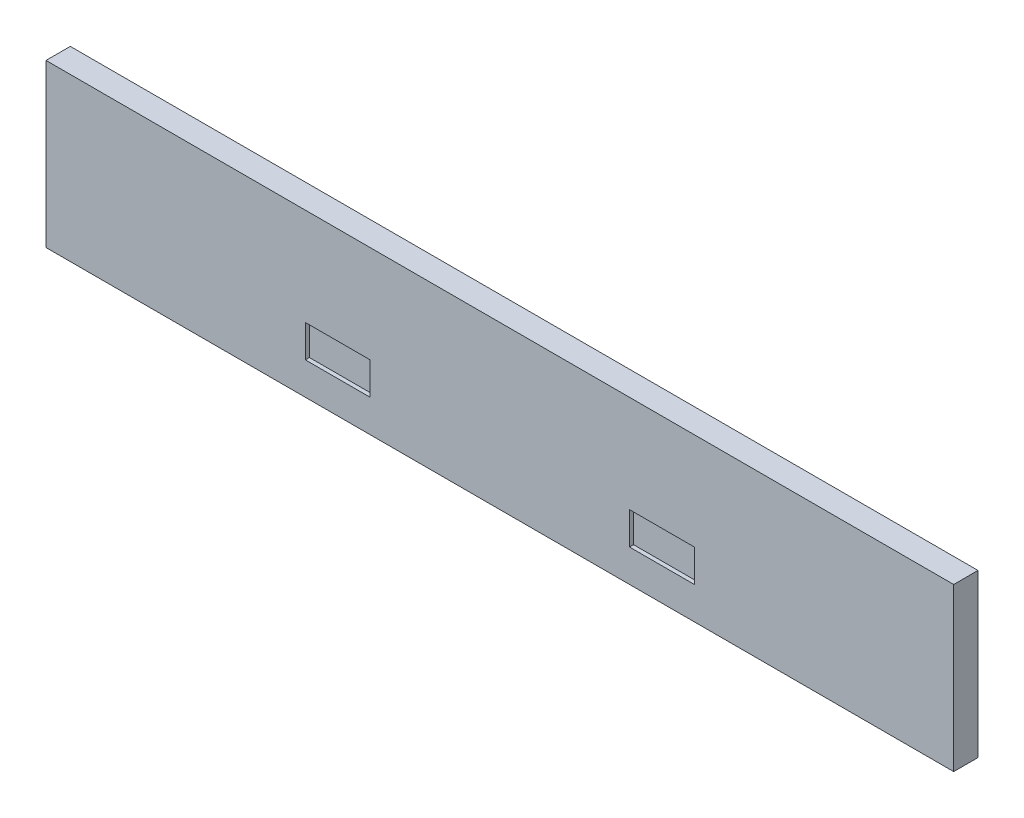
ISO-10303-21;
HEADER;
FILE_DESCRIPTION(('STEP AP214'),'2;1');
FILE_NAME('part.step','',(''),(''),'','','');
FILE_SCHEMA(('AUTOMOTIVE_DESIGN { 1 0 10303 214 1 1 1 1 }'));
ENDSEC;
DATA;
#1=APPLICATION_CONTEXT('core data for automotive mechanical design processes');
#2=APPLICATION_PROTOCOL_DEFINITION('international standard','automotive_design',2000,#1);
#3=PRODUCT_CONTEXT('',#1,'mechanical');
#4=PRODUCT('Part','Part','',(#3));
#5=PRODUCT_RELATED_PRODUCT_CATEGORY('part','',(#4));
#6=PRODUCT_DEFINITION_FORMATION('','',#4);
#7=PRODUCT_DEFINITION_CONTEXT('part definition',#1,'design');
#8=PRODUCT_DEFINITION('design','',#6,#7);
#9=PRODUCT_DEFINITION_SHAPE('','',#8);
#10=(LENGTH_UNIT() NAMED_UNIT(*) SI_UNIT(.MILLI.,.METRE.));
#11=(NAMED_UNIT(*) PLANE_ANGLE_UNIT() SI_UNIT($,.RADIAN.));
#12=(NAMED_UNIT(*) SI_UNIT($,.STERADIAN.) SOLID_ANGLE_UNIT());
#13=UNCERTAINTY_MEASURE_WITH_UNIT(LENGTH_MEASURE(1.E-05),#10,'distance_accuracy_value','');
#14=(GEOMETRIC_REPRESENTATION_CONTEXT(3) GLOBAL_UNCERTAINTY_ASSIGNED_CONTEXT((#13)) GLOBAL_UNIT_ASSIGNED_CONTEXT((#10,
#11,#12)) REPRESENTATION_CONTEXT('',''));
#15=CARTESIAN_POINT('',(0.,0.,0.));
#16=DIRECTION('',(0.,0.,1.));
#17=DIRECTION('',(1.,0.,0.));
#18=AXIS2_PLACEMENT_3D('',#15,#16,#17);
#19=CARTESIAN_POINT('',(0.,0.,19.05));
#20=DIRECTION('',(1.,0.,0.));
#21=DIRECTION('',(0.,0.,-1.));
#22=AXIS2_PLACEMENT_3D('',#19,#20,#21);
#23=PLANE('',#22);
#24=DIRECTION('',(0.,-1.,0.));
#25=VECTOR('',#24,1.);
#26=CARTESIAN_POINT('',(0.,0.,0.));
#27=LINE('',#26,#25);
#28=CARTESIAN_POINT('',(0.,127.,0.));
#29=VERTEX_POINT('',#28);
#30=CARTESIAN_POINT('',(0.,0.,0.));
#31=VERTEX_POINT('',#30);
#32=EDGE_CURVE('E158',#29,#31,#27,.T.);
#33=ORIENTED_EDGE('',*,*,#32,.T.);
#34=DIRECTION('',(0.,0.,-1.));
#35=VECTOR('',#34,1.);
#36=CARTESIAN_POINT('',(0.,0.,19.05));
#37=LINE('',#36,#35);
#38=CARTESIAN_POINT('',(0.,0.,19.05));
#39=VERTEX_POINT('',#38);
#40=EDGE_CURVE('E11',#39,#31,#37,.T.);
#41=ORIENTED_EDGE('',*,*,#40,.F.);
#42=DIRECTION('',(0.,-1.,0.));
#43=VECTOR('',#42,1.);
#44=CARTESIAN_POINT('',(0.,0.,19.05));
#45=LINE('',#44,#43);
#46=CARTESIAN_POINT('',(0.,127.,19.05));
#47=VERTEX_POINT('',#46);
#48=EDGE_CURVE('E191',#47,#39,#45,.T.);
#49=ORIENTED_EDGE('',*,*,#48,.F.);
#50=DIRECTION('',(0.,0.,-1.));
#51=VECTOR('',#50,1.);
#52=CARTESIAN_POINT('',(0.,127.,19.05));
#53=LINE('',#52,#51);
#54=EDGE_CURVE('E201',#47,#29,#53,.T.);
#55=ORIENTED_EDGE('',*,*,#54,.T.);
#56=EDGE_LOOP('',(#33,#41,#49,#55));
#57=FACE_BOUND('',#56,.T.);
#58=ADVANCED_FACE('F34',(#57),#23,.F.);
#59=CARTESIAN_POINT('',(0.,0.,19.05));
#60=DIRECTION('',(0.,1.,0.));
#61=DIRECTION('',(0.,0.,1.));
#62=AXIS2_PLACEMENT_3D('',#59,#60,#61);
#63=PLANE('',#62);
#64=DIRECTION('',(1.,0.,0.));
#65=VECTOR('',#64,1.);
#66=CARTESIAN_POINT('',(0.,0.,0.));
#67=LINE('',#66,#65);
#68=CARTESIAN_POINT('',(711.2,0.,0.));
#69=VERTEX_POINT('',#68);
#70=EDGE_CURVE('E204',#31,#69,#67,.T.);
#71=ORIENTED_EDGE('',*,*,#70,.T.);
#72=DIRECTION('',(0.,0.,-1.));
#73=VECTOR('',#72,1.);
#74=CARTESIAN_POINT('',(711.2,0.,19.05));
#75=LINE('',#74,#73);
#76=CARTESIAN_POINT('',(711.2,0.,19.05));
#77=VERTEX_POINT('',#76);
#78=EDGE_CURVE('E41',#77,#69,#75,.T.);
#79=ORIENTED_EDGE('',*,*,#78,.F.);
#80=DIRECTION('',(1.,0.,0.));
#81=VECTOR('',#80,1.);
#82=CARTESIAN_POINT('',(0.,0.,19.05));
#83=LINE('',#82,#81);
#84=EDGE_CURVE('E194',#39,#77,#83,.T.);
#85=ORIENTED_EDGE('',*,*,#84,.F.);
#86=ORIENTED_EDGE('',*,*,#40,.T.);
#87=EDGE_LOOP('',(#71,#79,#85,#86));
#88=FACE_BOUND('',#87,.T.);
#89=ADVANCED_FACE('F234',(#88),#63,.F.);
#90=CARTESIAN_POINT('',(711.2,0.,19.05));
#91=DIRECTION('',(-1.,0.,0.));
#92=DIRECTION('',(0.,0.,1.));
#93=AXIS2_PLACEMENT_3D('',#90,#91,#92);
#94=PLANE('',#93);
#95=DIRECTION('',(0.,1.,0.));
#96=VECTOR('',#95,1.);
#97=CARTESIAN_POINT('',(711.2,0.,0.));
#98=LINE('',#97,#96);
#99=CARTESIAN_POINT('',(711.2,127.,0.));
#100=VERTEX_POINT('',#99);
#101=EDGE_CURVE('E206',#69,#100,#98,.T.);
#102=ORIENTED_EDGE('',*,*,#101,.T.);
#103=DIRECTION('',(0.,0.,-1.));
#104=VECTOR('',#103,1.);
#105=CARTESIAN_POINT('',(711.2,127.,19.05));
#106=LINE('',#105,#104);
#107=CARTESIAN_POINT('',(711.2,127.,19.05));
#108=VERTEX_POINT('',#107);
#109=EDGE_CURVE('E211',#108,#100,#106,.T.);
#110=ORIENTED_EDGE('',*,*,#109,.F.);
#111=DIRECTION('',(0.,1.,0.));
#112=VECTOR('',#111,1.);
#113=CARTESIAN_POINT('',(711.2,0.,19.05));
#114=LINE('',#113,#112);
#115=EDGE_CURVE('E197',#77,#108,#114,.T.);
#116=ORIENTED_EDGE('',*,*,#115,.F.);
#117=ORIENTED_EDGE('',*,*,#78,.T.);
#118=EDGE_LOOP('',(#102,#110,#116,#117));
#119=FACE_BOUND('',#118,.T.);
#120=ADVANCED_FACE('F218',(#119),#94,.F.);
#121=CARTESIAN_POINT('',(0.,127.,19.05));
#122=DIRECTION('',(0.,-1.,0.));
#123=DIRECTION('',(0.,0.,-1.));
#124=AXIS2_PLACEMENT_3D('',#121,#122,#123);
#125=PLANE('',#124);
#126=DIRECTION('',(-1.,0.,0.));
#127=VECTOR('',#126,1.);
#128=CARTESIAN_POINT('',(0.,127.,0.));
#129=LINE('',#128,#127);
#130=EDGE_CURVE('E195',#100,#29,#129,.T.);
#131=ORIENTED_EDGE('',*,*,#130,.T.);
#132=ORIENTED_EDGE('',*,*,#54,.F.);
#133=DIRECTION('',(-1.,0.,0.));
#134=VECTOR('',#133,1.);
#135=CARTESIAN_POINT('',(0.,127.,19.05));
#136=LINE('',#135,#134);
#137=EDGE_CURVE('E199',#108,#47,#136,.T.);
#138=ORIENTED_EDGE('',*,*,#137,.F.);
#139=ORIENTED_EDGE('',*,*,#109,.T.);
#140=EDGE_LOOP('',(#131,#132,#138,#139));
#141=FACE_BOUND('',#140,.T.);
#142=ADVANCED_FACE('F227',(#141),#125,.F.);
#143=CARTESIAN_POINT('',(0.,0.,19.05));
#144=DIRECTION('',(0.,0.,-1.));
#145=DIRECTION('',(-1.,0.,0.));
#146=AXIS2_PLACEMENT_3D('',#143,#144,#145);
#147=PLANE('',#146);
#148=DIRECTION('',(1.,0.,0.));
#149=VECTOR('',#148,1.);
#150=CARTESIAN_POINT('',(203.2,25.4,19.05));
#151=LINE('',#150,#149);
#152=CARTESIAN_POINT('',(203.2,25.4,19.05));
#153=VERTEX_POINT('',#152);
#154=CARTESIAN_POINT('',(254.,25.4,19.05));
#155=VERTEX_POINT('',#154);
#156=EDGE_CURVE('E151',#153,#155,#151,.T.);
#157=ORIENTED_EDGE('',*,*,#156,.F.);
#158=DIRECTION('',(0.,-1.,0.));
#159=VECTOR('',#158,1.);
#160=CARTESIAN_POINT('',(203.2,50.8,19.05));
#161=LINE('',#160,#159);
#162=CARTESIAN_POINT('',(203.2,50.8,19.05));
#163=VERTEX_POINT('',#162);
#164=EDGE_CURVE('E48',#163,#153,#161,.T.);
#165=ORIENTED_EDGE('',*,*,#164,.F.);
#166=DIRECTION('',(-1.,0.,0.));
#167=VECTOR('',#166,1.);
#168=CARTESIAN_POINT('',(203.2,50.8,19.05));
#169=LINE('',#168,#167);
#170=CARTESIAN_POINT('',(254.,50.8,19.05));
#171=VERTEX_POINT('',#170);
#172=EDGE_CURVE('E142',#171,#163,#169,.T.);
#173=ORIENTED_EDGE('',*,*,#172,.F.);
#174=DIRECTION('',(0.,1.,0.));
#175=VECTOR('',#174,1.);
#176=CARTESIAN_POINT('',(254.,50.8,19.05));
#177=LINE('',#176,#175);
#178=EDGE_CURVE('E145',#155,#171,#177,.T.);
#179=ORIENTED_EDGE('',*,*,#178,.F.);
#180=EDGE_LOOP('',(#157,#165,#173,#179));
#181=FACE_BOUND('',#180,.T.);
#182=DIRECTION('',(1.,0.,0.));
#183=VECTOR('',#182,1.);
#184=CARTESIAN_POINT('',(457.2,25.4,19.05));
#185=LINE('',#184,#183);
#186=CARTESIAN_POINT('',(457.2,25.4,19.05));
#187=VERTEX_POINT('',#186);
#188=CARTESIAN_POINT('',(508.,25.4,19.05));
#189=VERTEX_POINT('',#188);
#190=EDGE_CURVE('E177',#187,#189,#185,.T.);
#191=ORIENTED_EDGE('',*,*,#190,.F.);
#192=DIRECTION('',(0.,-1.,0.));
#193=VECTOR('',#192,1.);
#194=CARTESIAN_POINT('',(457.2,50.8,19.05));
#195=LINE('',#194,#193);
#196=CARTESIAN_POINT('',(457.2,50.8,19.05));
#197=VERTEX_POINT('',#196);
#198=EDGE_CURVE('E56',#197,#187,#195,.T.);
#199=ORIENTED_EDGE('',*,*,#198,.F.);
#200=DIRECTION('',(-1.,0.,0.));
#201=VECTOR('',#200,1.);
#202=CARTESIAN_POINT('',(457.2,50.8,19.05));
#203=LINE('',#202,#201);
#204=CARTESIAN_POINT('',(508.,50.8,19.05));
#205=VERTEX_POINT('',#204);
#206=EDGE_CURVE('E166',#205,#197,#203,.T.);
#207=ORIENTED_EDGE('',*,*,#206,.F.);
#208=DIRECTION('',(0.,1.,0.));
#209=VECTOR('',#208,1.);
#210=CARTESIAN_POINT('',(508.,50.8,19.05));
#211=LINE('',#210,#209);
#212=EDGE_CURVE('E180',#189,#205,#211,.T.);
#213=ORIENTED_EDGE('',*,*,#212,.F.);
#214=EDGE_LOOP('',(#191,#199,#207,#213));
#215=FACE_BOUND('',#214,.T.);
#216=ORIENTED_EDGE('',*,*,#48,.T.);
#217=ORIENTED_EDGE('',*,*,#84,.T.);
#218=ORIENTED_EDGE('',*,*,#115,.T.);
#219=ORIENTED_EDGE('',*,*,#137,.T.);
#220=EDGE_LOOP('',(#216,#217,#218,#219));
#221=FACE_BOUND('',#220,.T.);
#222=ADVANCED_FACE('F233',(#181,#215,#221),#147,.F.);
#223=CARTESIAN_POINT('',(0.,0.,0.));
#224=DIRECTION('',(0.,0.,-1.));
#225=DIRECTION('',(-1.,0.,0.));
#226=AXIS2_PLACEMENT_3D('',#223,#224,#225);
#227=PLANE('',#226);
#228=ORIENTED_EDGE('',*,*,#32,.F.);
#229=ORIENTED_EDGE('',*,*,#130,.F.);
#230=ORIENTED_EDGE('',*,*,#101,.F.);
#231=ORIENTED_EDGE('',*,*,#70,.F.);
#232=EDGE_LOOP('',(#228,#229,#230,#231));
#233=FACE_BOUND('',#232,.T.);
#234=ADVANCED_FACE('F224',(#233),#227,.T.);
#235=CARTESIAN_POINT('',(457.2,50.8,15.875));
#236=DIRECTION('',(-1.,0.,0.));
#237=DIRECTION('',(0.,0.,1.));
#238=AXIS2_PLACEMENT_3D('',#235,#236,#237);
#239=PLANE('',#238);
#240=ORIENTED_EDGE('',*,*,#198,.T.);
#241=DIRECTION('',(0.,0.,1.));
#242=VECTOR('',#241,1.);
#243=CARTESIAN_POINT('',(457.2,25.4,15.875));
#244=LINE('',#243,#242);
#245=CARTESIAN_POINT('',(457.2,25.4,15.875));
#246=VERTEX_POINT('',#245);
#247=EDGE_CURVE('E175',#246,#187,#244,.T.);
#248=ORIENTED_EDGE('',*,*,#247,.F.);
#249=DIRECTION('',(0.,-1.,0.));
#250=VECTOR('',#249,1.);
#251=CARTESIAN_POINT('',(457.2,50.8,15.875));
#252=LINE('',#251,#250);
#253=CARTESIAN_POINT('',(457.2,50.8,15.875));
#254=VERTEX_POINT('',#253);
#255=EDGE_CURVE('E162',#254,#246,#252,.T.);
#256=ORIENTED_EDGE('',*,*,#255,.F.);
#257=DIRECTION('',(0.,0.,1.));
#258=VECTOR('',#257,1.);
#259=CARTESIAN_POINT('',(457.2,50.8,15.875));
#260=LINE('',#259,#258);
#261=EDGE_CURVE('E152',#254,#197,#260,.T.);
#262=ORIENTED_EDGE('',*,*,#261,.T.);
#263=EDGE_LOOP('',(#240,#248,#256,#262));
#264=FACE_BOUND('',#263,.T.);
#265=ADVANCED_FACE('F246',(#264),#239,.F.);
#266=CARTESIAN_POINT('',(457.2,50.8,15.875));
#267=DIRECTION('',(0.,1.,0.));
#268=DIRECTION('',(0.,0.,1.));
#269=AXIS2_PLACEMENT_3D('',#266,#267,#268);
#270=PLANE('',#269);
#271=ORIENTED_EDGE('',*,*,#206,.T.);
#272=ORIENTED_EDGE('',*,*,#261,.F.);
#273=DIRECTION('',(-1.,0.,0.));
#274=VECTOR('',#273,1.);
#275=CARTESIAN_POINT('',(457.2,50.8,15.875));
#276=LINE('',#275,#274);
#277=CARTESIAN_POINT('',(508.,50.8,15.875));
#278=VERTEX_POINT('',#277);
#279=EDGE_CURVE('E172',#278,#254,#276,.T.);
#280=ORIENTED_EDGE('',*,*,#279,.F.);
#281=DIRECTION('',(0.,0.,1.));
#282=VECTOR('',#281,1.);
#283=CARTESIAN_POINT('',(508.,50.8,15.875));
#284=LINE('',#283,#282);
#285=EDGE_CURVE('E186',#278,#205,#284,.T.);
#286=ORIENTED_EDGE('',*,*,#285,.T.);
#287=EDGE_LOOP('',(#271,#272,#280,#286));
#288=FACE_BOUND('',#287,.T.);
#289=ADVANCED_FACE('F252',(#288),#270,.F.);
#290=CARTESIAN_POINT('',(508.,50.8,15.875));
#291=DIRECTION('',(1.,0.,0.));
#292=DIRECTION('',(0.,0.,-1.));
#293=AXIS2_PLACEMENT_3D('',#290,#291,#292);
#294=PLANE('',#293);
#295=ORIENTED_EDGE('',*,*,#212,.T.);
#296=ORIENTED_EDGE('',*,*,#285,.F.);
#297=DIRECTION('',(0.,1.,0.));
#298=VECTOR('',#297,1.);
#299=CARTESIAN_POINT('',(508.,50.8,15.875));
#300=LINE('',#299,#298);
#301=CARTESIAN_POINT('',(508.,25.4,15.875));
#302=VERTEX_POINT('',#301);
#303=EDGE_CURVE('E169',#302,#278,#300,.T.);
#304=ORIENTED_EDGE('',*,*,#303,.F.);
#305=DIRECTION('',(0.,0.,1.));
#306=VECTOR('',#305,1.);
#307=CARTESIAN_POINT('',(508.,25.4,15.875));
#308=LINE('',#307,#306);
#309=EDGE_CURVE('E188',#302,#189,#308,.T.);
#310=ORIENTED_EDGE('',*,*,#309,.T.);
#311=EDGE_LOOP('',(#295,#296,#304,#310));
#312=FACE_BOUND('',#311,.T.);
#313=ADVANCED_FACE('F257',(#312),#294,.F.);
#314=CARTESIAN_POINT('',(457.2,25.4,15.875));
#315=DIRECTION('',(0.,-1.,0.));
#316=DIRECTION('',(0.,0.,-1.));
#317=AXIS2_PLACEMENT_3D('',#314,#315,#316);
#318=PLANE('',#317);
#319=ORIENTED_EDGE('',*,*,#190,.T.);
#320=ORIENTED_EDGE('',*,*,#309,.F.);
#321=DIRECTION('',(1.,0.,0.));
#322=VECTOR('',#321,1.);
#323=CARTESIAN_POINT('',(457.2,25.4,15.875));
#324=LINE('',#323,#322);
#325=EDGE_CURVE('E165',#246,#302,#324,.T.);
#326=ORIENTED_EDGE('',*,*,#325,.F.);
#327=ORIENTED_EDGE('',*,*,#247,.T.);
#328=EDGE_LOOP('',(#319,#320,#326,#327));
#329=FACE_BOUND('',#328,.T.);
#330=ADVANCED_FACE('F253',(#329),#318,.F.);
#331=CARTESIAN_POINT('',(0.,0.,15.875));
#332=DIRECTION('',(0.,0.,1.));
#333=DIRECTION('',(1.,0.,0.));
#334=AXIS2_PLACEMENT_3D('',#331,#332,#333);
#335=PLANE('',#334);
#336=ORIENTED_EDGE('',*,*,#255,.T.);
#337=ORIENTED_EDGE('',*,*,#325,.T.);
#338=ORIENTED_EDGE('',*,*,#303,.T.);
#339=ORIENTED_EDGE('',*,*,#279,.T.);
#340=EDGE_LOOP('',(#336,#337,#338,#339));
#341=FACE_BOUND('',#340,.T.);
#342=ADVANCED_FACE('F256',(#341),#335,.T.);
#343=CARTESIAN_POINT('',(203.2,50.8,15.875));
#344=DIRECTION('',(-1.,0.,0.));
#345=DIRECTION('',(0.,0.,1.));
#346=AXIS2_PLACEMENT_3D('',#343,#344,#345);
#347=PLANE('',#346);
#348=ORIENTED_EDGE('',*,*,#164,.T.);
#349=DIRECTION('',(0.,0.,1.));
#350=VECTOR('',#349,1.);
#351=CARTESIAN_POINT('',(203.2,25.4,15.875));
#352=LINE('',#351,#350);
#353=CARTESIAN_POINT('',(203.2,25.4,15.875));
#354=VERTEX_POINT('',#353);
#355=EDGE_CURVE('E120',#354,#153,#352,.T.);
#356=ORIENTED_EDGE('',*,*,#355,.F.);
#357=DIRECTION('',(0.,-1.,0.));
#358=VECTOR('',#357,1.);
#359=CARTESIAN_POINT('',(203.2,50.8,15.875));
#360=LINE('',#359,#358);
#361=CARTESIAN_POINT('',(203.2,50.8,15.875));
#362=VERTEX_POINT('',#361);
#363=EDGE_CURVE('E124',#362,#354,#360,.T.);
#364=ORIENTED_EDGE('',*,*,#363,.F.);
#365=DIRECTION('',(0.,0.,1.));
#366=VECTOR('',#365,1.);
#367=CARTESIAN_POINT('',(203.2,50.8,15.875));
#368=LINE('',#367,#366);
#369=EDGE_CURVE('E156',#362,#163,#368,.T.);
#370=ORIENTED_EDGE('',*,*,#369,.T.);
#371=EDGE_LOOP('',(#348,#356,#364,#370));
#372=FACE_BOUND('',#371,.T.);
#373=ADVANCED_FACE('F122',(#372),#347,.F.);
#374=CARTESIAN_POINT('',(203.2,50.8,15.875));
#375=DIRECTION('',(0.,1.,0.));
#376=DIRECTION('',(0.,0.,1.));
#377=AXIS2_PLACEMENT_3D('',#374,#375,#376);
#378=PLANE('',#377);
#379=ORIENTED_EDGE('',*,*,#172,.T.);
#380=ORIENTED_EDGE('',*,*,#369,.F.);
#381=DIRECTION('',(-1.,0.,0.));
#382=VECTOR('',#381,1.);
#383=CARTESIAN_POINT('',(203.2,50.8,15.875));
#384=LINE('',#383,#382);
#385=CARTESIAN_POINT('',(254.,50.8,15.875));
#386=VERTEX_POINT('',#385);
#387=EDGE_CURVE('E130',#386,#362,#384,.T.);
#388=ORIENTED_EDGE('',*,*,#387,.F.);
#389=DIRECTION('',(0.,0.,1.));
#390=VECTOR('',#389,1.);
#391=CARTESIAN_POINT('',(254.,50.8,15.875));
#392=LINE('',#391,#390);
#393=EDGE_CURVE('E159',#386,#171,#392,.T.);
#394=ORIENTED_EDGE('',*,*,#393,.T.);
#395=EDGE_LOOP('',(#379,#380,#388,#394));
#396=FACE_BOUND('',#395,.T.);
#397=ADVANCED_FACE('F270',(#396),#378,.F.);
#398=CARTESIAN_POINT('',(254.,50.8,15.875));
#399=DIRECTION('',(1.,0.,0.));
#400=DIRECTION('',(0.,0.,-1.));
#401=AXIS2_PLACEMENT_3D('',#398,#399,#400);
#402=PLANE('',#401);
#403=ORIENTED_EDGE('',*,*,#178,.T.);
#404=ORIENTED_EDGE('',*,*,#393,.F.);
#405=DIRECTION('',(0.,1.,0.));
#406=VECTOR('',#405,1.);
#407=CARTESIAN_POINT('',(254.,50.8,15.875));
#408=LINE('',#407,#406);
#409=CARTESIAN_POINT('',(254.,25.4,15.875));
#410=VERTEX_POINT('',#409);
#411=EDGE_CURVE('E138',#410,#386,#408,.T.);
#412=ORIENTED_EDGE('',*,*,#411,.F.);
#413=DIRECTION('',(0.,0.,1.));
#414=VECTOR('',#413,1.);
#415=CARTESIAN_POINT('',(254.,25.4,15.875));
#416=LINE('',#415,#414);
#417=EDGE_CURVE('E129',#410,#155,#416,.T.);
#418=ORIENTED_EDGE('',*,*,#417,.T.);
#419=EDGE_LOOP('',(#403,#404,#412,#418));
#420=FACE_BOUND('',#419,.T.);
#421=ADVANCED_FACE('F273',(#420),#402,.F.);
#422=CARTESIAN_POINT('',(203.2,25.4,15.875));
#423=DIRECTION('',(0.,-1.,0.));
#424=DIRECTION('',(1.,0.,0.));
#425=AXIS2_PLACEMENT_3D('',#422,#423,#424);
#426=PLANE('',#425);
#427=ORIENTED_EDGE('',*,*,#156,.T.);
#428=ORIENTED_EDGE('',*,*,#417,.F.);
#429=DIRECTION('',(1.,0.,0.));
#430=VECTOR('',#429,1.);
#431=CARTESIAN_POINT('',(203.2,25.4,15.875));
#432=LINE('',#431,#430);
#433=EDGE_CURVE('E133',#354,#410,#432,.T.);
#434=ORIENTED_EDGE('',*,*,#433,.F.);
#435=ORIENTED_EDGE('',*,*,#355,.T.);
#436=EDGE_LOOP('',(#427,#428,#434,#435));
#437=FACE_BOUND('',#436,.T.);
#438=ADVANCED_FACE('F134',(#437),#426,.F.);
#439=CARTESIAN_POINT('',(0.,0.,15.875));
#440=DIRECTION('',(0.,0.,1.));
#441=DIRECTION('',(1.,0.,0.));
#442=AXIS2_PLACEMENT_3D('',#439,#440,#441);
#443=PLANE('',#442);
#444=ORIENTED_EDGE('',*,*,#363,.T.);
#445=ORIENTED_EDGE('',*,*,#433,.T.);
#446=ORIENTED_EDGE('',*,*,#411,.T.);
#447=ORIENTED_EDGE('',*,*,#387,.T.);
#448=EDGE_LOOP('',(#444,#445,#446,#447));
#449=FACE_BOUND('',#448,.T.);
#450=ADVANCED_FACE('F140',(#449),#443,.T.);
#451=CLOSED_SHELL('',(#58,#89,#120,#142,#222,#234,#265,#289,#313,#330,#342,#373,#397,#421,#438,#450));
#452=MANIFOLD_SOLID_BREP('B2',#451);
#453=ADVANCED_BREP_SHAPE_REPRESENTATION('',(#18,#452),#14);
#454=SHAPE_DEFINITION_REPRESENTATION(#9,#453);
ENDSEC;
END-ISO-10303-21;
